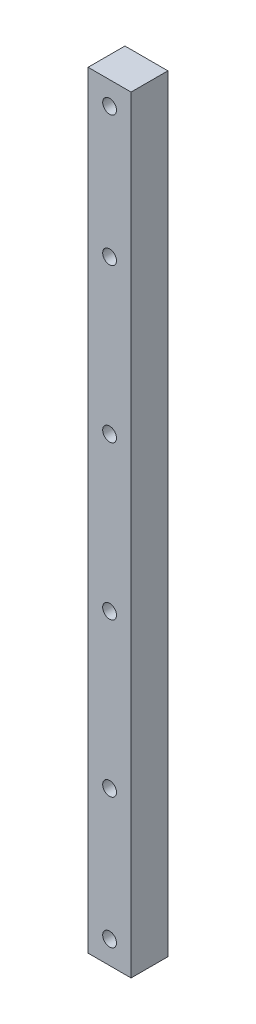
ISO-10303-21;
HEADER;
FILE_DESCRIPTION(('STEP AP214'),'2;1');
FILE_NAME('part.step','',(''),(''),'','','');
FILE_SCHEMA(('AUTOMOTIVE_DESIGN { 1 0 10303 214 1 1 1 1 }'));
ENDSEC;
DATA;
#1=APPLICATION_CONTEXT('core data for automotive mechanical design processes');
#2=APPLICATION_PROTOCOL_DEFINITION('international standard','automotive_design',2000,#1);
#3=PRODUCT_CONTEXT('',#1,'mechanical');
#4=PRODUCT('Part','Part','',(#3));
#5=PRODUCT_RELATED_PRODUCT_CATEGORY('part','',(#4));
#6=PRODUCT_DEFINITION_FORMATION('','',#4);
#7=PRODUCT_DEFINITION_CONTEXT('part definition',#1,'design');
#8=PRODUCT_DEFINITION('design','',#6,#7);
#9=PRODUCT_DEFINITION_SHAPE('','',#8);
#10=(LENGTH_UNIT() NAMED_UNIT(*) SI_UNIT(.MILLI.,.METRE.));
#11=(NAMED_UNIT(*) PLANE_ANGLE_UNIT() SI_UNIT($,.RADIAN.));
#12=(NAMED_UNIT(*) SI_UNIT($,.STERADIAN.) SOLID_ANGLE_UNIT());
#13=UNCERTAINTY_MEASURE_WITH_UNIT(LENGTH_MEASURE(1.E-05),#10,'distance_accuracy_value','');
#14=(GEOMETRIC_REPRESENTATION_CONTEXT(3) GLOBAL_UNCERTAINTY_ASSIGNED_CONTEXT((#13)) GLOBAL_UNIT_ASSIGNED_CONTEXT((#10,
#11,#12)) REPRESENTATION_CONTEXT('',''));
#15=CARTESIAN_POINT('',(0.,0.,0.));
#16=DIRECTION('',(0.,0.,1.));
#17=DIRECTION('',(1.,0.,0.));
#18=AXIS2_PLACEMENT_3D('',#15,#16,#17);
#19=CARTESIAN_POINT('',(7.,250.,6.));
#20=DIRECTION('',(-1.,0.,0.));
#21=DIRECTION('',(0.,0.,1.));
#22=AXIS2_PLACEMENT_3D('',#19,#20,#21);
#23=PLANE('',#22);
#24=DIRECTION('',(0.,0.,-1.));
#25=VECTOR('',#24,1.);
#26=CARTESIAN_POINT('',(7.,0.,6.));
#27=LINE('',#26,#25);
#28=CARTESIAN_POINT('',(7.,0.,6.));
#29=VERTEX_POINT('',#28);
#30=CARTESIAN_POINT('',(7.,0.,-6.));
#31=VERTEX_POINT('',#30);
#32=EDGE_CURVE('E101',#29,#31,#27,.T.);
#33=ORIENTED_EDGE('',*,*,#32,.T.);
#34=DIRECTION('',(0.,-1.,0.));
#35=VECTOR('',#34,1.);
#36=CARTESIAN_POINT('',(7.,250.,-6.));
#37=LINE('',#36,#35);
#38=CARTESIAN_POINT('',(7.,250.,-6.));
#39=VERTEX_POINT('',#38);
#40=EDGE_CURVE('E11',#39,#31,#37,.T.);
#41=ORIENTED_EDGE('',*,*,#40,.F.);
#42=DIRECTION('',(0.,0.,-1.));
#43=VECTOR('',#42,1.);
#44=CARTESIAN_POINT('',(7.,250.,6.));
#45=LINE('',#44,#43);
#46=CARTESIAN_POINT('',(7.,250.,6.));
#47=VERTEX_POINT('',#46);
#48=EDGE_CURVE('E89',#47,#39,#45,.T.);
#49=ORIENTED_EDGE('',*,*,#48,.F.);
#50=DIRECTION('',(0.,-1.,0.));
#51=VECTOR('',#50,1.);
#52=CARTESIAN_POINT('',(7.,250.,6.));
#53=LINE('',#52,#51);
#54=EDGE_CURVE('E97',#47,#29,#53,.T.);
#55=ORIENTED_EDGE('',*,*,#54,.T.);
#56=EDGE_LOOP('',(#33,#41,#49,#55));
#57=FACE_BOUND('',#56,.T.);
#58=ADVANCED_FACE('F38',(#57),#23,.F.);
#59=CARTESIAN_POINT('',(-7.,250.,-6.));
#60=DIRECTION('',(0.,0.,1.));
#61=DIRECTION('',(1.,0.,0.));
#62=AXIS2_PLACEMENT_3D('',#59,#60,#61);
#63=PLANE('',#62);
#64=CARTESIAN_POINT('',(0.,200.,-6.));
#65=DIRECTION('',(0.,0.,-1.));
#66=DIRECTION('',(-1.,0.,0.));
#67=AXIS2_PLACEMENT_3D('',#64,#65,#66);
#68=CIRCLE('',#67,2.25);
#69=CARTESIAN_POINT('',(-2.25000000000001,200.,-6.));
#70=VERTEX_POINT('',#69);
#71=EDGE_CURVE('E143',#70,#70,#68,.T.);
#72=ORIENTED_EDGE('',*,*,#71,.F.);
#73=EDGE_LOOP('',(#72));
#74=FACE_BOUND('',#73,.T.);
#75=CARTESIAN_POINT('',(-5.26783817824338E-13,150.,-6.));
#76=DIRECTION('',(0.,0.,-1.));
#77=DIRECTION('',(-1.,0.,0.));
#78=AXIS2_PLACEMENT_3D('',#75,#76,#77);
#79=CIRCLE('',#78,2.25);
#80=CARTESIAN_POINT('',(-2.25000000000053,150.,-6.));
#81=VERTEX_POINT('',#80);
#82=EDGE_CURVE('E137',#81,#81,#79,.T.);
#83=ORIENTED_EDGE('',*,*,#82,.F.);
#84=EDGE_LOOP('',(#83));
#85=FACE_BOUND('',#84,.T.);
#86=CARTESIAN_POINT('',(-1.04744440165294E-12,100.,-6.));
#87=DIRECTION('',(0.,0.,-1.));
#88=DIRECTION('',(-1.,0.,0.));
#89=AXIS2_PLACEMENT_3D('',#86,#87,#88);
#90=CIRCLE('',#89,2.25);
#91=CARTESIAN_POINT('',(-2.25000000000105,100.,-6.));
#92=VERTEX_POINT('',#91);
#93=EDGE_CURVE('E130',#92,#92,#90,.T.);
#94=ORIENTED_EDGE('',*,*,#93,.F.);
#95=EDGE_LOOP('',(#94));
#96=FACE_BOUND('',#95,.T.);
#97=CARTESIAN_POINT('',(-1.56810498548154E-12,50.,-6.));
#98=DIRECTION('',(0.,0.,-1.));
#99=DIRECTION('',(-1.,0.,0.));
#100=AXIS2_PLACEMENT_3D('',#97,#98,#99);
#101=CIRCLE('',#100,2.25);
#102=CARTESIAN_POINT('',(-2.25000000000157,50.,-6.));
#103=VERTEX_POINT('',#102);
#104=EDGE_CURVE('E131',#103,#103,#101,.T.);
#105=ORIENTED_EDGE('',*,*,#104,.F.);
#106=EDGE_LOOP('',(#105));
#107=FACE_BOUND('',#106,.T.);
#108=CARTESIAN_POINT('',(0.,7.5,-6.));
#109=DIRECTION('',(0.,0.,1.));
#110=DIRECTION('',(1.,0.,0.));
#111=AXIS2_PLACEMENT_3D('',#108,#109,#110);
#112=CIRCLE('',#111,2.25);
#113=CARTESIAN_POINT('',(2.25,7.5,-6.));
#114=VERTEX_POINT('',#113);
#115=EDGE_CURVE('E104',#114,#114,#112,.T.);
#116=ORIENTED_EDGE('',*,*,#115,.T.);
#117=EDGE_LOOP('',(#116));
#118=FACE_BOUND('',#117,.T.);
#119=CARTESIAN_POINT('',(0.,242.5,-6.));
#120=DIRECTION('',(0.,0.,1.));
#121=DIRECTION('',(1.,0.,0.));
#122=AXIS2_PLACEMENT_3D('',#119,#120,#121);
#123=CIRCLE('',#122,2.25);
#124=CARTESIAN_POINT('',(2.25,242.5,-6.));
#125=VERTEX_POINT('',#124);
#126=EDGE_CURVE('E118',#125,#125,#123,.T.);
#127=ORIENTED_EDGE('',*,*,#126,.T.);
#128=EDGE_LOOP('',(#127));
#129=FACE_BOUND('',#128,.T.);
#130=DIRECTION('',(-1.,0.,0.));
#131=VECTOR('',#130,1.);
#132=CARTESIAN_POINT('',(-7.,0.,-6.));
#133=LINE('',#132,#131);
#134=CARTESIAN_POINT('',(-7.,0.,-6.));
#135=VERTEX_POINT('',#134);
#136=EDGE_CURVE('E93',#31,#135,#133,.T.);
#137=ORIENTED_EDGE('',*,*,#136,.T.);
#138=DIRECTION('',(0.,-1.,0.));
#139=VECTOR('',#138,1.);
#140=CARTESIAN_POINT('',(-7.,250.,-6.));
#141=LINE('',#140,#139);
#142=CARTESIAN_POINT('',(-7.,250.,-6.));
#143=VERTEX_POINT('',#142);
#144=EDGE_CURVE('E46',#143,#135,#141,.T.);
#145=ORIENTED_EDGE('',*,*,#144,.F.);
#146=DIRECTION('',(-1.,0.,0.));
#147=VECTOR('',#146,1.);
#148=CARTESIAN_POINT('',(-7.,250.,-6.));
#149=LINE('',#148,#147);
#150=EDGE_CURVE('E84',#39,#143,#149,.T.);
#151=ORIENTED_EDGE('',*,*,#150,.F.);
#152=ORIENTED_EDGE('',*,*,#40,.T.);
#153=EDGE_LOOP('',(#137,#145,#151,#152));
#154=FACE_BOUND('',#153,.T.);
#155=ADVANCED_FACE('F92',(#74,#85,#96,#107,#118,#129,#154),#63,.F.);
#156=CARTESIAN_POINT('',(-7.,250.,6.));
#157=DIRECTION('',(1.,0.,0.));
#158=DIRECTION('',(0.,0.,-1.));
#159=AXIS2_PLACEMENT_3D('',#156,#157,#158);
#160=PLANE('',#159);
#161=DIRECTION('',(0.,0.,1.));
#162=VECTOR('',#161,1.);
#163=CARTESIAN_POINT('',(-7.,0.,6.));
#164=LINE('',#163,#162);
#165=CARTESIAN_POINT('',(-7.,0.,6.));
#166=VERTEX_POINT('',#165);
#167=EDGE_CURVE('E71',#135,#166,#164,.T.);
#168=ORIENTED_EDGE('',*,*,#167,.T.);
#169=DIRECTION('',(0.,-1.,0.));
#170=VECTOR('',#169,1.);
#171=CARTESIAN_POINT('',(-7.,250.,6.));
#172=LINE('',#171,#170);
#173=CARTESIAN_POINT('',(-7.,250.,6.));
#174=VERTEX_POINT('',#173);
#175=EDGE_CURVE('E94',#174,#166,#172,.T.);
#176=ORIENTED_EDGE('',*,*,#175,.F.);
#177=DIRECTION('',(0.,0.,1.));
#178=VECTOR('',#177,1.);
#179=CARTESIAN_POINT('',(-7.,250.,6.));
#180=LINE('',#179,#178);
#181=EDGE_CURVE('E87',#143,#174,#180,.T.);
#182=ORIENTED_EDGE('',*,*,#181,.F.);
#183=ORIENTED_EDGE('',*,*,#144,.T.);
#184=EDGE_LOOP('',(#168,#176,#182,#183));
#185=FACE_BOUND('',#184,.T.);
#186=ADVANCED_FACE('F95',(#185),#160,.F.);
#187=CARTESIAN_POINT('',(-7.,250.,6.));
#188=DIRECTION('',(0.,0.,-1.));
#189=DIRECTION('',(-1.,0.,0.));
#190=AXIS2_PLACEMENT_3D('',#187,#188,#189);
#191=PLANE('',#190);
#192=CARTESIAN_POINT('',(0.,200.,6.));
#193=DIRECTION('',(0.,0.,-1.));
#194=DIRECTION('',(-1.,0.,0.));
#195=AXIS2_PLACEMENT_3D('',#192,#193,#194);
#196=CIRCLE('',#195,2.25);
#197=CARTESIAN_POINT('',(-2.25000000000001,200.,6.));
#198=VERTEX_POINT('',#197);
#199=EDGE_CURVE('E119',#198,#198,#196,.F.);
#200=ORIENTED_EDGE('',*,*,#199,.F.);
#201=EDGE_LOOP('',(#200));
#202=FACE_BOUND('',#201,.T.);
#203=CARTESIAN_POINT('',(-5.26783817824338E-13,150.,6.));
#204=DIRECTION('',(0.,0.,-1.));
#205=DIRECTION('',(-1.,0.,0.));
#206=AXIS2_PLACEMENT_3D('',#203,#204,#205);
#207=CIRCLE('',#206,2.25);
#208=CARTESIAN_POINT('',(-2.25000000000053,150.,6.));
#209=VERTEX_POINT('',#208);
#210=EDGE_CURVE('E140',#209,#209,#207,.F.);
#211=ORIENTED_EDGE('',*,*,#210,.F.);
#212=EDGE_LOOP('',(#211));
#213=FACE_BOUND('',#212,.T.);
#214=CARTESIAN_POINT('',(-1.04744440165294E-12,100.,6.));
#215=DIRECTION('',(0.,0.,-1.));
#216=DIRECTION('',(-1.,0.,0.));
#217=AXIS2_PLACEMENT_3D('',#214,#215,#216);
#218=CIRCLE('',#217,2.25);
#219=CARTESIAN_POINT('',(-2.25000000000105,100.,6.));
#220=VERTEX_POINT('',#219);
#221=EDGE_CURVE('E134',#220,#220,#218,.F.);
#222=ORIENTED_EDGE('',*,*,#221,.F.);
#223=EDGE_LOOP('',(#222));
#224=FACE_BOUND('',#223,.T.);
#225=CARTESIAN_POINT('',(-1.56810498548154E-12,50.,6.));
#226=DIRECTION('',(0.,0.,-1.));
#227=DIRECTION('',(-1.,0.,0.));
#228=AXIS2_PLACEMENT_3D('',#225,#226,#227);
#229=CIRCLE('',#228,2.25);
#230=CARTESIAN_POINT('',(-2.25000000000157,50.,6.));
#231=VERTEX_POINT('',#230);
#232=EDGE_CURVE('E127',#231,#231,#229,.F.);
#233=ORIENTED_EDGE('',*,*,#232,.F.);
#234=EDGE_LOOP('',(#233));
#235=FACE_BOUND('',#234,.T.);
#236=CARTESIAN_POINT('',(0.,7.5,6.));
#237=DIRECTION('',(0.,0.,1.));
#238=DIRECTION('',(1.,0.,0.));
#239=AXIS2_PLACEMENT_3D('',#236,#237,#238);
#240=CIRCLE('',#239,2.25);
#241=CARTESIAN_POINT('',(2.25,7.5,6.));
#242=VERTEX_POINT('',#241);
#243=EDGE_CURVE('E122',#242,#242,#240,.T.);
#244=ORIENTED_EDGE('',*,*,#243,.F.);
#245=EDGE_LOOP('',(#244));
#246=FACE_BOUND('',#245,.T.);
#247=CARTESIAN_POINT('',(0.,242.5,6.));
#248=DIRECTION('',(0.,0.,1.));
#249=DIRECTION('',(1.,0.,0.));
#250=AXIS2_PLACEMENT_3D('',#247,#248,#249);
#251=CIRCLE('',#250,2.25);
#252=CARTESIAN_POINT('',(2.25,242.5,6.));
#253=VERTEX_POINT('',#252);
#254=EDGE_CURVE('E115',#253,#253,#251,.T.);
#255=ORIENTED_EDGE('',*,*,#254,.F.);
#256=EDGE_LOOP('',(#255));
#257=FACE_BOUND('',#256,.T.);
#258=DIRECTION('',(1.,0.,0.));
#259=VECTOR('',#258,1.);
#260=CARTESIAN_POINT('',(-7.,0.,6.));
#261=LINE('',#260,#259);
#262=EDGE_CURVE('E77',#166,#29,#261,.T.);
#263=ORIENTED_EDGE('',*,*,#262,.T.);
#264=ORIENTED_EDGE('',*,*,#54,.F.);
#265=DIRECTION('',(1.,0.,0.));
#266=VECTOR('',#265,1.);
#267=CARTESIAN_POINT('',(-7.,250.,6.));
#268=LINE('',#267,#266);
#269=EDGE_CURVE('E54',#174,#47,#268,.T.);
#270=ORIENTED_EDGE('',*,*,#269,.F.);
#271=ORIENTED_EDGE('',*,*,#175,.T.);
#272=EDGE_LOOP('',(#263,#264,#270,#271));
#273=FACE_BOUND('',#272,.T.);
#274=ADVANCED_FACE('F109',(#202,#213,#224,#235,#246,#257,#273),#191,.F.);
#275=CARTESIAN_POINT('',(0.,250.,0.));
#276=DIRECTION('',(0.,-1.,0.));
#277=DIRECTION('',(0.,0.,-1.));
#278=AXIS2_PLACEMENT_3D('',#275,#276,#277);
#279=PLANE('',#278);
#280=ORIENTED_EDGE('',*,*,#48,.T.);
#281=ORIENTED_EDGE('',*,*,#150,.T.);
#282=ORIENTED_EDGE('',*,*,#181,.T.);
#283=ORIENTED_EDGE('',*,*,#269,.T.);
#284=EDGE_LOOP('',(#280,#281,#282,#283));
#285=FACE_BOUND('',#284,.T.);
#286=ADVANCED_FACE('F85',(#285),#279,.F.);
#287=CARTESIAN_POINT('',(0.,0.,0.));
#288=DIRECTION('',(0.,-1.,0.));
#289=DIRECTION('',(0.,0.,-1.));
#290=AXIS2_PLACEMENT_3D('',#287,#288,#289);
#291=PLANE('',#290);
#292=ORIENTED_EDGE('',*,*,#32,.F.);
#293=ORIENTED_EDGE('',*,*,#262,.F.);
#294=ORIENTED_EDGE('',*,*,#167,.F.);
#295=ORIENTED_EDGE('',*,*,#136,.F.);
#296=EDGE_LOOP('',(#292,#293,#294,#295));
#297=FACE_BOUND('',#296,.T.);
#298=ADVANCED_FACE('F112',(#297),#291,.T.);
#299=CARTESIAN_POINT('',(0.,242.5,-6.));
#300=DIRECTION('',(0.,0.,1.));
#301=DIRECTION('',(1.,0.,0.));
#302=AXIS2_PLACEMENT_3D('',#299,#300,#301);
#303=CYLINDRICAL_SURFACE('',#302,2.25);
#304=ORIENTED_EDGE('',*,*,#126,.F.);
#305=EDGE_LOOP('',(#304));
#306=FACE_BOUND('',#305,.T.);
#307=ORIENTED_EDGE('',*,*,#254,.T.);
#308=EDGE_LOOP('',(#307));
#309=FACE_BOUND('',#308,.T.);
#310=ADVANCED_FACE('F166',(#306,#309),#303,.F.);
#311=CARTESIAN_POINT('',(0.,7.5,-6.));
#312=DIRECTION('',(0.,0.,1.));
#313=DIRECTION('',(1.,0.,0.));
#314=AXIS2_PLACEMENT_3D('',#311,#312,#313);
#315=CYLINDRICAL_SURFACE('',#314,2.25);
#316=ORIENTED_EDGE('',*,*,#115,.F.);
#317=EDGE_LOOP('',(#316));
#318=FACE_BOUND('',#317,.T.);
#319=ORIENTED_EDGE('',*,*,#243,.T.);
#320=EDGE_LOOP('',(#319));
#321=FACE_BOUND('',#320,.T.);
#322=ADVANCED_FACE('F169',(#318,#321),#315,.F.);
#323=CARTESIAN_POINT('',(-1.56810498548154E-12,50.,6.001));
#324=DIRECTION('',(0.,0.,-1.));
#325=DIRECTION('',(-1.,0.,0.));
#326=AXIS2_PLACEMENT_3D('',#323,#324,#325);
#327=CYLINDRICAL_SURFACE('',#326,2.25);
#328=ORIENTED_EDGE('',*,*,#104,.T.);
#329=EDGE_LOOP('',(#328));
#330=FACE_BOUND('',#329,.T.);
#331=ORIENTED_EDGE('',*,*,#232,.T.);
#332=EDGE_LOOP('',(#331));
#333=FACE_BOUND('',#332,.T.);
#334=ADVANCED_FACE('F224',(#330,#333),#327,.F.);
#335=CARTESIAN_POINT('',(-1.04744440165294E-12,100.,6.001));
#336=DIRECTION('',(0.,0.,-1.));
#337=DIRECTION('',(-1.,0.,0.));
#338=AXIS2_PLACEMENT_3D('',#335,#336,#337);
#339=CYLINDRICAL_SURFACE('',#338,2.25);
#340=ORIENTED_EDGE('',*,*,#93,.T.);
#341=EDGE_LOOP('',(#340));
#342=FACE_BOUND('',#341,.T.);
#343=ORIENTED_EDGE('',*,*,#221,.T.);
#344=EDGE_LOOP('',(#343));
#345=FACE_BOUND('',#344,.T.);
#346=ADVANCED_FACE('F235',(#342,#345),#339,.F.);
#347=CARTESIAN_POINT('',(-5.26783817824338E-13,150.,6.001));
#348=DIRECTION('',(0.,0.,-1.));
#349=DIRECTION('',(-1.,0.,0.));
#350=AXIS2_PLACEMENT_3D('',#347,#348,#349);
#351=CYLINDRICAL_SURFACE('',#350,2.25);
#352=ORIENTED_EDGE('',*,*,#82,.T.);
#353=EDGE_LOOP('',(#352));
#354=FACE_BOUND('',#353,.T.);
#355=ORIENTED_EDGE('',*,*,#210,.T.);
#356=EDGE_LOOP('',(#355));
#357=FACE_BOUND('',#356,.T.);
#358=ADVANCED_FACE('F242',(#354,#357),#351,.F.);
#359=CARTESIAN_POINT('',(0.,200.,6.001));
#360=DIRECTION('',(0.,0.,-1.));
#361=DIRECTION('',(-1.,0.,0.));
#362=AXIS2_PLACEMENT_3D('',#359,#360,#361);
#363=CYLINDRICAL_SURFACE('',#362,2.25);
#364=ORIENTED_EDGE('',*,*,#71,.T.);
#365=EDGE_LOOP('',(#364));
#366=FACE_BOUND('',#365,.T.);
#367=ORIENTED_EDGE('',*,*,#199,.T.);
#368=EDGE_LOOP('',(#367));
#369=FACE_BOUND('',#368,.T.);
#370=ADVANCED_FACE('F151',(#366,#369),#363,.F.);
#371=CLOSED_SHELL('',(#58,#155,#186,#274,#286,#298,#310,#322,#334,#346,#358,#370));
#372=MANIFOLD_SOLID_BREP('B2',#371);
#373=ADVANCED_BREP_SHAPE_REPRESENTATION('',(#18,#372),#14);
#374=SHAPE_DEFINITION_REPRESENTATION(#9,#373);
ENDSEC;
END-ISO-10303-21;
